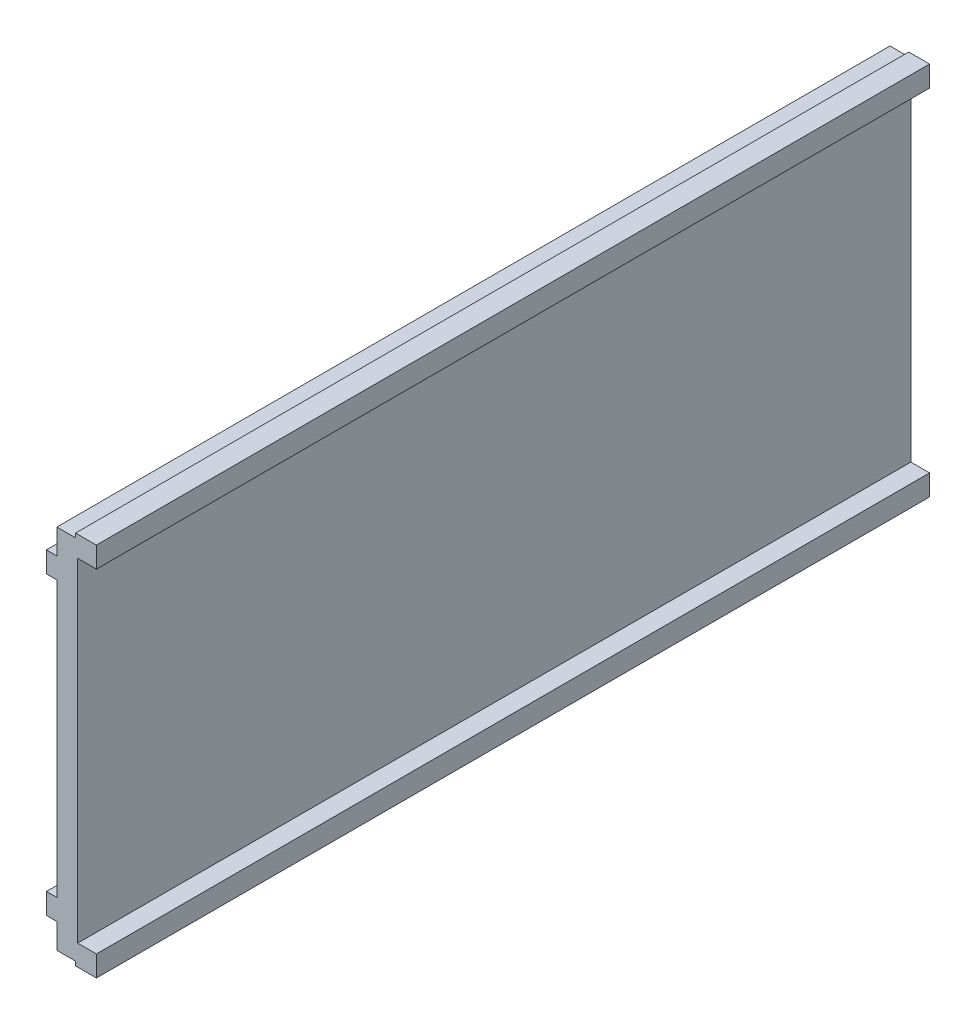
ISO-10303-21;
HEADER;
FILE_DESCRIPTION(('STEP AP214'),'2;1');
FILE_NAME('part.step','',(''),(''),'','','');
FILE_SCHEMA(('AUTOMOTIVE_DESIGN { 1 0 10303 214 1 1 1 1 }'));
ENDSEC;
DATA;
#1=APPLICATION_CONTEXT('core data for automotive mechanical design processes');
#2=APPLICATION_PROTOCOL_DEFINITION('international standard','automotive_design',2000,#1);
#3=PRODUCT_CONTEXT('',#1,'mechanical');
#4=PRODUCT('Part','Part','',(#3));
#5=PRODUCT_RELATED_PRODUCT_CATEGORY('part','',(#4));
#6=PRODUCT_DEFINITION_FORMATION('','',#4);
#7=PRODUCT_DEFINITION_CONTEXT('part definition',#1,'design');
#8=PRODUCT_DEFINITION('design','',#6,#7);
#9=PRODUCT_DEFINITION_SHAPE('','',#8);
#10=(LENGTH_UNIT() NAMED_UNIT(*) SI_UNIT(.MILLI.,.METRE.));
#11=(NAMED_UNIT(*) PLANE_ANGLE_UNIT() SI_UNIT($,.RADIAN.));
#12=(NAMED_UNIT(*) SI_UNIT($,.STERADIAN.) SOLID_ANGLE_UNIT());
#13=UNCERTAINTY_MEASURE_WITH_UNIT(LENGTH_MEASURE(1.E-05),#10,'distance_accuracy_value','');
#14=(GEOMETRIC_REPRESENTATION_CONTEXT(3) GLOBAL_UNCERTAINTY_ASSIGNED_CONTEXT((#13)) GLOBAL_UNIT_ASSIGNED_CONTEXT((#10,
#11,#12)) REPRESENTATION_CONTEXT('',''));
#15=CARTESIAN_POINT('',(0.,0.,0.));
#16=DIRECTION('',(0.,0.,1.));
#17=DIRECTION('',(1.,0.,0.));
#18=AXIS2_PLACEMENT_3D('',#15,#16,#17);
#19=CARTESIAN_POINT('',(-41.0418835039148,-5.20889143025013,200.));
#20=DIRECTION('',(0.,-1.,0.));
#21=DIRECTION('',(1.,0.,0.));
#22=AXIS2_PLACEMENT_3D('',#19,#20,#21);
#23=PLANE('',#22);
#24=DIRECTION('',(-1.,0.,0.));
#25=VECTOR('',#24,1.);
#26=CARTESIAN_POINT('',(-41.0418835039148,-5.20889143025013,0.));
#27=LINE('',#26,#25);
#28=CARTESIAN_POINT('',(-41.0418835039148,-5.20889143025013,0.));
#29=VERTEX_POINT('',#28);
#30=CARTESIAN_POINT('',(-46.0418835039148,-5.20889143025013,0.));
#31=VERTEX_POINT('',#30);
#32=EDGE_CURVE('E207',#29,#31,#27,.T.);
#33=ORIENTED_EDGE('',*,*,#32,.T.);
#34=DIRECTION('',(0.,0.,-1.));
#35=VECTOR('',#34,1.);
#36=CARTESIAN_POINT('',(-46.0418835039148,-5.20889143025013,200.));
#37=LINE('',#36,#35);
#38=CARTESIAN_POINT('',(-46.0418835039148,-5.20889143025013,200.));
#39=VERTEX_POINT('',#38);
#40=EDGE_CURVE('E11',#39,#31,#37,.T.);
#41=ORIENTED_EDGE('',*,*,#40,.F.);
#42=DIRECTION('',(-1.,0.,0.));
#43=VECTOR('',#42,1.);
#44=CARTESIAN_POINT('',(-41.0418835039148,-5.20889143025013,200.));
#45=LINE('',#44,#43);
#46=CARTESIAN_POINT('',(-41.0418835039148,-5.20889143025013,200.));
#47=VERTEX_POINT('',#46);
#48=EDGE_CURVE('E245',#47,#39,#45,.T.);
#49=ORIENTED_EDGE('',*,*,#48,.F.);
#50=DIRECTION('',(0.,0.,-1.));
#51=VECTOR('',#50,1.);
#52=CARTESIAN_POINT('',(-41.0418835039148,-5.20889143025013,200.));
#53=LINE('',#52,#51);
#54=EDGE_CURVE('E203',#47,#29,#53,.T.);
#55=ORIENTED_EDGE('',*,*,#54,.T.);
#56=EDGE_LOOP('',(#33,#41,#49,#55));
#57=FACE_BOUND('',#56,.T.);
#58=ADVANCED_FACE('F39',(#57),#23,.F.);
#59=CARTESIAN_POINT('',(-46.0418835039148,-5.20889143025013,200.));
#60=DIRECTION('',(1.,0.,0.));
#61=DIRECTION('',(0.,1.,0.));
#62=AXIS2_PLACEMENT_3D('',#59,#60,#61);
#63=PLANE('',#62);
#64=DIRECTION('',(0.,-1.,0.));
#65=VECTOR('',#64,1.);
#66=CARTESIAN_POINT('',(-46.0418835039148,-5.20889143025013,0.));
#67=LINE('',#66,#65);
#68=CARTESIAN_POINT('',(-46.0418835039148,-6.20889143025013,0.));
#69=VERTEX_POINT('',#68);
#70=EDGE_CURVE('E210',#31,#69,#67,.T.);
#71=ORIENTED_EDGE('',*,*,#70,.T.);
#72=DIRECTION('',(0.,0.,-1.));
#73=VECTOR('',#72,1.);
#74=CARTESIAN_POINT('',(-46.0418835039148,-6.20889143025013,200.));
#75=LINE('',#74,#73);
#76=CARTESIAN_POINT('',(-46.0418835039148,-6.20889143025013,200.));
#77=VERTEX_POINT('',#76);
#78=EDGE_CURVE('E47',#77,#69,#75,.T.);
#79=ORIENTED_EDGE('',*,*,#78,.F.);
#80=DIRECTION('',(0.,-1.,0.));
#81=VECTOR('',#80,1.);
#82=CARTESIAN_POINT('',(-46.0418835039148,-5.20889143025013,200.));
#83=LINE('',#82,#81);
#84=EDGE_CURVE('E134',#39,#77,#83,.T.);
#85=ORIENTED_EDGE('',*,*,#84,.F.);
#86=ORIENTED_EDGE('',*,*,#40,.T.);
#87=EDGE_LOOP('',(#71,#79,#85,#86));
#88=FACE_BOUND('',#87,.T.);
#89=ADVANCED_FACE('F363',(#88),#63,.F.);
#90=CARTESIAN_POINT('',(-46.0418835039148,-6.20889143025013,200.));
#91=DIRECTION('',(0.,-1.,0.));
#92=DIRECTION('',(1.,0.,0.));
#93=AXIS2_PLACEMENT_3D('',#90,#91,#92);
#94=PLANE('',#93);
#95=DIRECTION('',(-1.,0.,0.));
#96=VECTOR('',#95,1.);
#97=CARTESIAN_POINT('',(-46.0418835039148,-6.20889143025013,0.));
#98=LINE('',#97,#96);
#99=CARTESIAN_POINT('',(-50.5418835039148,-6.20889143025013,0.));
#100=VERTEX_POINT('',#99);
#101=EDGE_CURVE('E212',#69,#100,#98,.T.);
#102=ORIENTED_EDGE('',*,*,#101,.T.);
#103=DIRECTION('',(0.,0.,-1.));
#104=VECTOR('',#103,1.);
#105=CARTESIAN_POINT('',(-50.5418835039148,-6.20889143025013,200.));
#106=LINE('',#105,#104);
#107=CARTESIAN_POINT('',(-50.5418835039148,-6.20889143025013,200.));
#108=VERTEX_POINT('',#107);
#109=EDGE_CURVE('E288',#108,#100,#106,.T.);
#110=ORIENTED_EDGE('',*,*,#109,.F.);
#111=DIRECTION('',(-1.,0.,0.));
#112=VECTOR('',#111,1.);
#113=CARTESIAN_POINT('',(-46.0418835039148,-6.20889143025013,200.));
#114=LINE('',#113,#112);
#115=EDGE_CURVE('E296',#77,#108,#114,.T.);
#116=ORIENTED_EDGE('',*,*,#115,.F.);
#117=ORIENTED_EDGE('',*,*,#78,.T.);
#118=EDGE_LOOP('',(#102,#110,#116,#117));
#119=FACE_BOUND('',#118,.T.);
#120=ADVANCED_FACE('F294',(#119),#94,.F.);
#121=CARTESIAN_POINT('',(-50.5418835039148,-6.20889143025013,200.));
#122=DIRECTION('',(1.,0.,0.));
#123=DIRECTION('',(0.,0.,-1.));
#124=AXIS2_PLACEMENT_3D('',#121,#122,#123);
#125=PLANE('',#124);
#126=DIRECTION('',(0.,-1.,0.));
#127=VECTOR('',#126,1.);
#128=CARTESIAN_POINT('',(-50.5418835039148,-6.20889143025013,0.));
#129=LINE('',#128,#127);
#130=CARTESIAN_POINT('',(-50.5418835039148,-12.2088914302501,0.));
#131=VERTEX_POINT('',#130);
#132=EDGE_CURVE('E214',#100,#131,#129,.T.);
#133=ORIENTED_EDGE('',*,*,#132,.T.);
#134=DIRECTION('',(0.,0.,-1.));
#135=VECTOR('',#134,1.);
#136=CARTESIAN_POINT('',(-50.5418835039148,-12.2088914302501,200.));
#137=LINE('',#136,#135);
#138=CARTESIAN_POINT('',(-50.5418835039148,-12.2088914302501,200.));
#139=VERTEX_POINT('',#138);
#140=EDGE_CURVE('E285',#139,#131,#137,.T.);
#141=ORIENTED_EDGE('',*,*,#140,.F.);
#142=DIRECTION('',(0.,-1.,0.));
#143=VECTOR('',#142,1.);
#144=CARTESIAN_POINT('',(-50.5418835039148,-6.20889143025013,200.));
#145=LINE('',#144,#143);
#146=EDGE_CURVE('E314',#108,#139,#145,.T.);
#147=ORIENTED_EDGE('',*,*,#146,.F.);
#148=ORIENTED_EDGE('',*,*,#109,.T.);
#149=EDGE_LOOP('',(#133,#141,#147,#148));
#150=FACE_BOUND('',#149,.T.);
#151=ADVANCED_FACE('F305',(#150),#125,.F.);
#152=CARTESIAN_POINT('',(-53.0418835039148,-12.2088914302501,200.));
#153=DIRECTION('',(0.,-1.,0.));
#154=DIRECTION('',(0.,0.,-1.));
#155=AXIS2_PLACEMENT_3D('',#152,#153,#154);
#156=PLANE('',#155);
#157=DIRECTION('',(-1.,0.,0.));
#158=VECTOR('',#157,1.);
#159=CARTESIAN_POINT('',(-53.0418835039148,-12.2088914302501,0.));
#160=LINE('',#159,#158);
#161=CARTESIAN_POINT('',(-53.0418835039148,-12.2088914302501,0.));
#162=VERTEX_POINT('',#161);
#163=EDGE_CURVE('E216',#131,#162,#160,.T.);
#164=ORIENTED_EDGE('',*,*,#163,.T.);
#165=DIRECTION('',(0.,0.,-1.));
#166=VECTOR('',#165,1.);
#167=CARTESIAN_POINT('',(-53.0418835039148,-12.2088914302501,200.));
#168=LINE('',#167,#166);
#169=CARTESIAN_POINT('',(-53.0418835039148,-12.2088914302501,200.));
#170=VERTEX_POINT('',#169);
#171=EDGE_CURVE('E282',#170,#162,#168,.T.);
#172=ORIENTED_EDGE('',*,*,#171,.F.);
#173=DIRECTION('',(-1.,0.,0.));
#174=VECTOR('',#173,1.);
#175=CARTESIAN_POINT('',(-53.0418835039148,-12.2088914302501,200.));
#176=LINE('',#175,#174);
#177=EDGE_CURVE('E311',#139,#170,#176,.T.);
#178=ORIENTED_EDGE('',*,*,#177,.F.);
#179=ORIENTED_EDGE('',*,*,#140,.T.);
#180=EDGE_LOOP('',(#164,#172,#178,#179));
#181=FACE_BOUND('',#180,.T.);
#182=ADVANCED_FACE('F309',(#181),#156,.F.);
#183=CARTESIAN_POINT('',(-53.0418835039148,-12.2088914302501,200.));
#184=DIRECTION('',(1.,0.,0.));
#185=DIRECTION('',(0.,0.,-1.));
#186=AXIS2_PLACEMENT_3D('',#183,#184,#185);
#187=PLANE('',#186);
#188=DIRECTION('',(0.,-1.,0.));
#189=VECTOR('',#188,1.);
#190=CARTESIAN_POINT('',(-53.0418835039148,-12.2088914302501,0.));
#191=LINE('',#190,#189);
#192=CARTESIAN_POINT('',(-53.0418835039148,-17.2088914302501,0.));
#193=VERTEX_POINT('',#192);
#194=EDGE_CURVE('E218',#162,#193,#191,.T.);
#195=ORIENTED_EDGE('',*,*,#194,.T.);
#196=DIRECTION('',(0.,0.,-1.));
#197=VECTOR('',#196,1.);
#198=CARTESIAN_POINT('',(-53.0418835039148,-17.2088914302501,200.));
#199=LINE('',#198,#197);
#200=CARTESIAN_POINT('',(-53.0418835039148,-17.2088914302501,200.));
#201=VERTEX_POINT('',#200);
#202=EDGE_CURVE('E279',#201,#193,#199,.T.);
#203=ORIENTED_EDGE('',*,*,#202,.F.);
#204=DIRECTION('',(0.,-1.,0.));
#205=VECTOR('',#204,1.);
#206=CARTESIAN_POINT('',(-53.0418835039148,-12.2088914302501,200.));
#207=LINE('',#206,#205);
#208=EDGE_CURVE('E313',#170,#201,#207,.T.);
#209=ORIENTED_EDGE('',*,*,#208,.F.);
#210=ORIENTED_EDGE('',*,*,#171,.T.);
#211=EDGE_LOOP('',(#195,#203,#209,#210));
#212=FACE_BOUND('',#211,.T.);
#213=ADVANCED_FACE('F376',(#212),#187,.F.);
#214=CARTESIAN_POINT('',(-53.0418835039148,-17.2088914302501,200.));
#215=DIRECTION('',(0.,1.,0.));
#216=DIRECTION('',(0.,0.,1.));
#217=AXIS2_PLACEMENT_3D('',#214,#215,#216);
#218=PLANE('',#217);
#219=DIRECTION('',(1.,0.,0.));
#220=VECTOR('',#219,1.);
#221=CARTESIAN_POINT('',(-53.0418835039148,-17.2088914302501,0.));
#222=LINE('',#221,#220);
#223=CARTESIAN_POINT('',(-50.5418835039148,-17.2088914302501,0.));
#224=VERTEX_POINT('',#223);
#225=EDGE_CURVE('E220',#193,#224,#222,.T.);
#226=ORIENTED_EDGE('',*,*,#225,.T.);
#227=DIRECTION('',(0.,0.,-1.));
#228=VECTOR('',#227,1.);
#229=CARTESIAN_POINT('',(-50.5418835039148,-17.2088914302501,200.));
#230=LINE('',#229,#228);
#231=CARTESIAN_POINT('',(-50.5418835039148,-17.2088914302501,200.));
#232=VERTEX_POINT('',#231);
#233=EDGE_CURVE('E276',#232,#224,#230,.T.);
#234=ORIENTED_EDGE('',*,*,#233,.F.);
#235=DIRECTION('',(1.,0.,0.));
#236=VECTOR('',#235,1.);
#237=CARTESIAN_POINT('',(-53.0418835039148,-17.2088914302501,200.));
#238=LINE('',#237,#236);
#239=EDGE_CURVE('E316',#201,#232,#238,.T.);
#240=ORIENTED_EDGE('',*,*,#239,.F.);
#241=ORIENTED_EDGE('',*,*,#202,.T.);
#242=EDGE_LOOP('',(#226,#234,#240,#241));
#243=FACE_BOUND('',#242,.T.);
#244=ADVANCED_FACE('F379',(#243),#218,.F.);
#245=CARTESIAN_POINT('',(-50.5418835039148,-17.2088914302501,200.));
#246=DIRECTION('',(1.,0.,0.));
#247=DIRECTION('',(0.,0.,-1.));
#248=AXIS2_PLACEMENT_3D('',#245,#246,#247);
#249=PLANE('',#248);
#250=DIRECTION('',(0.,-1.,0.));
#251=VECTOR('',#250,1.);
#252=CARTESIAN_POINT('',(-50.5418835039148,-17.2088914302501,0.));
#253=LINE('',#252,#251);
#254=CARTESIAN_POINT('',(-50.5418835039148,-83.2088914302501,0.));
#255=VERTEX_POINT('',#254);
#256=EDGE_CURVE('E222',#224,#255,#253,.T.);
#257=ORIENTED_EDGE('',*,*,#256,.T.);
#258=DIRECTION('',(0.,0.,-1.));
#259=VECTOR('',#258,1.);
#260=CARTESIAN_POINT('',(-50.5418835039148,-83.2088914302501,200.));
#261=LINE('',#260,#259);
#262=CARTESIAN_POINT('',(-50.5418835039148,-83.2088914302501,200.));
#263=VERTEX_POINT('',#262);
#264=EDGE_CURVE('E273',#263,#255,#261,.T.);
#265=ORIENTED_EDGE('',*,*,#264,.F.);
#266=DIRECTION('',(0.,-1.,0.));
#267=VECTOR('',#266,1.);
#268=CARTESIAN_POINT('',(-50.5418835039148,-17.2088914302501,200.));
#269=LINE('',#268,#267);
#270=EDGE_CURVE('E322',#232,#263,#269,.T.);
#271=ORIENTED_EDGE('',*,*,#270,.F.);
#272=ORIENTED_EDGE('',*,*,#233,.T.);
#273=EDGE_LOOP('',(#257,#265,#271,#272));
#274=FACE_BOUND('',#273,.T.);
#275=ADVANCED_FACE('F383',(#274),#249,.F.);
#276=CARTESIAN_POINT('',(-53.0418835039148,-83.2088914302501,200.));
#277=DIRECTION('',(0.,-1.,0.));
#278=DIRECTION('',(0.,0.,-1.));
#279=AXIS2_PLACEMENT_3D('',#276,#277,#278);
#280=PLANE('',#279);
#281=DIRECTION('',(-1.,0.,0.));
#282=VECTOR('',#281,1.);
#283=CARTESIAN_POINT('',(-53.0418835039148,-83.2088914302501,0.));
#284=LINE('',#283,#282);
#285=CARTESIAN_POINT('',(-53.0418835039148,-83.2088914302501,0.));
#286=VERTEX_POINT('',#285);
#287=EDGE_CURVE('E224',#255,#286,#284,.T.);
#288=ORIENTED_EDGE('',*,*,#287,.T.);
#289=DIRECTION('',(0.,0.,-1.));
#290=VECTOR('',#289,1.);
#291=CARTESIAN_POINT('',(-53.0418835039148,-83.2088914302501,200.));
#292=LINE('',#291,#290);
#293=CARTESIAN_POINT('',(-53.0418835039148,-83.2088914302501,200.));
#294=VERTEX_POINT('',#293);
#295=EDGE_CURVE('E270',#294,#286,#292,.T.);
#296=ORIENTED_EDGE('',*,*,#295,.F.);
#297=DIRECTION('',(-1.,0.,0.));
#298=VECTOR('',#297,1.);
#299=CARTESIAN_POINT('',(-53.0418835039148,-83.2088914302501,200.));
#300=LINE('',#299,#298);
#301=EDGE_CURVE('E324',#263,#294,#300,.T.);
#302=ORIENTED_EDGE('',*,*,#301,.F.);
#303=ORIENTED_EDGE('',*,*,#264,.T.);
#304=EDGE_LOOP('',(#288,#296,#302,#303));
#305=FACE_BOUND('',#304,.T.);
#306=ADVANCED_FACE('F387',(#305),#280,.F.);
#307=CARTESIAN_POINT('',(-53.0418835039148,-88.2088914302501,200.));
#308=DIRECTION('',(1.,0.,0.));
#309=DIRECTION('',(0.,0.,-1.));
#310=AXIS2_PLACEMENT_3D('',#307,#308,#309);
#311=PLANE('',#310);
#312=DIRECTION('',(0.,-1.,0.));
#313=VECTOR('',#312,1.);
#314=CARTESIAN_POINT('',(-53.0418835039148,-88.2088914302501,0.));
#315=LINE('',#314,#313);
#316=CARTESIAN_POINT('',(-53.0418835039148,-88.2088914302501,0.));
#317=VERTEX_POINT('',#316);
#318=EDGE_CURVE('E226',#286,#317,#315,.T.);
#319=ORIENTED_EDGE('',*,*,#318,.T.);
#320=DIRECTION('',(0.,0.,-1.));
#321=VECTOR('',#320,1.);
#322=CARTESIAN_POINT('',(-53.0418835039148,-88.2088914302501,200.));
#323=LINE('',#322,#321);
#324=CARTESIAN_POINT('',(-53.0418835039148,-88.2088914302501,200.));
#325=VERTEX_POINT('',#324);
#326=EDGE_CURVE('E267',#325,#317,#323,.T.);
#327=ORIENTED_EDGE('',*,*,#326,.F.);
#328=DIRECTION('',(0.,-1.,0.));
#329=VECTOR('',#328,1.);
#330=CARTESIAN_POINT('',(-53.0418835039148,-88.2088914302501,200.));
#331=LINE('',#330,#329);
#332=EDGE_CURVE('E326',#294,#325,#331,.T.);
#333=ORIENTED_EDGE('',*,*,#332,.F.);
#334=ORIENTED_EDGE('',*,*,#295,.T.);
#335=EDGE_LOOP('',(#319,#327,#333,#334));
#336=FACE_BOUND('',#335,.T.);
#337=ADVANCED_FACE('F391',(#336),#311,.F.);
#338=CARTESIAN_POINT('',(-53.0418835039148,-88.2088914302501,200.));
#339=DIRECTION('',(0.,1.,0.));
#340=DIRECTION('',(0.,0.,1.));
#341=AXIS2_PLACEMENT_3D('',#338,#339,#340);
#342=PLANE('',#341);
#343=DIRECTION('',(1.,0.,0.));
#344=VECTOR('',#343,1.);
#345=CARTESIAN_POINT('',(-53.0418835039148,-88.2088914302501,0.));
#346=LINE('',#345,#344);
#347=CARTESIAN_POINT('',(-50.5418835039148,-88.2088914302501,0.));
#348=VERTEX_POINT('',#347);
#349=EDGE_CURVE('E228',#317,#348,#346,.T.);
#350=ORIENTED_EDGE('',*,*,#349,.T.);
#351=DIRECTION('',(0.,0.,-1.));
#352=VECTOR('',#351,1.);
#353=CARTESIAN_POINT('',(-50.5418835039148,-88.2088914302501,200.));
#354=LINE('',#353,#352);
#355=CARTESIAN_POINT('',(-50.5418835039148,-88.2088914302501,200.));
#356=VERTEX_POINT('',#355);
#357=EDGE_CURVE('E264',#356,#348,#354,.T.);
#358=ORIENTED_EDGE('',*,*,#357,.F.);
#359=DIRECTION('',(1.,0.,0.));
#360=VECTOR('',#359,1.);
#361=CARTESIAN_POINT('',(-53.0418835039148,-88.2088914302501,200.));
#362=LINE('',#361,#360);
#363=EDGE_CURVE('E328',#325,#356,#362,.T.);
#364=ORIENTED_EDGE('',*,*,#363,.F.);
#365=ORIENTED_EDGE('',*,*,#326,.T.);
#366=EDGE_LOOP('',(#350,#358,#364,#365));
#367=FACE_BOUND('',#366,.T.);
#368=ADVANCED_FACE('F395',(#367),#342,.F.);
#369=CARTESIAN_POINT('',(-50.5418835039148,-94.2088914302501,200.));
#370=DIRECTION('',(1.,0.,0.));
#371=DIRECTION('',(0.,0.,-1.));
#372=AXIS2_PLACEMENT_3D('',#369,#370,#371);
#373=PLANE('',#372);
#374=DIRECTION('',(0.,-1.,0.));
#375=VECTOR('',#374,1.);
#376=CARTESIAN_POINT('',(-50.5418835039148,-94.2088914302501,0.));
#377=LINE('',#376,#375);
#378=CARTESIAN_POINT('',(-50.5418835039148,-94.2088914302501,0.));
#379=VERTEX_POINT('',#378);
#380=EDGE_CURVE('E230',#348,#379,#377,.T.);
#381=ORIENTED_EDGE('',*,*,#380,.T.);
#382=DIRECTION('',(0.,0.,-1.));
#383=VECTOR('',#382,1.);
#384=CARTESIAN_POINT('',(-50.5418835039148,-94.2088914302501,200.));
#385=LINE('',#384,#383);
#386=CARTESIAN_POINT('',(-50.5418835039148,-94.2088914302501,200.));
#387=VERTEX_POINT('',#386);
#388=EDGE_CURVE('E261',#387,#379,#385,.T.);
#389=ORIENTED_EDGE('',*,*,#388,.F.);
#390=DIRECTION('',(0.,-1.,0.));
#391=VECTOR('',#390,1.);
#392=CARTESIAN_POINT('',(-50.5418835039148,-94.2088914302501,200.));
#393=LINE('',#392,#391);
#394=EDGE_CURVE('E330',#356,#387,#393,.T.);
#395=ORIENTED_EDGE('',*,*,#394,.F.);
#396=ORIENTED_EDGE('',*,*,#357,.T.);
#397=EDGE_LOOP('',(#381,#389,#395,#396));
#398=FACE_BOUND('',#397,.T.);
#399=ADVANCED_FACE('F399',(#398),#373,.F.);
#400=CARTESIAN_POINT('',(-46.0418835039148,-94.2088914302501,200.));
#401=DIRECTION('',(0.,1.,0.));
#402=DIRECTION('',(0.,0.,1.));
#403=AXIS2_PLACEMENT_3D('',#400,#401,#402);
#404=PLANE('',#403);
#405=DIRECTION('',(1.,0.,0.));
#406=VECTOR('',#405,1.);
#407=CARTESIAN_POINT('',(-46.0418835039148,-94.2088914302501,0.));
#408=LINE('',#407,#406);
#409=CARTESIAN_POINT('',(-46.0418835039148,-94.2088914302501,0.));
#410=VERTEX_POINT('',#409);
#411=EDGE_CURVE('E232',#379,#410,#408,.T.);
#412=ORIENTED_EDGE('',*,*,#411,.T.);
#413=DIRECTION('',(0.,0.,-1.));
#414=VECTOR('',#413,1.);
#415=CARTESIAN_POINT('',(-46.0418835039148,-94.2088914302501,200.));
#416=LINE('',#415,#414);
#417=CARTESIAN_POINT('',(-46.0418835039148,-94.2088914302501,200.));
#418=VERTEX_POINT('',#417);
#419=EDGE_CURVE('E258',#418,#410,#416,.T.);
#420=ORIENTED_EDGE('',*,*,#419,.F.);
#421=DIRECTION('',(1.,0.,0.));
#422=VECTOR('',#421,1.);
#423=CARTESIAN_POINT('',(-46.0418835039148,-94.2088914302501,200.));
#424=LINE('',#423,#422);
#425=EDGE_CURVE('E332',#387,#418,#424,.T.);
#426=ORIENTED_EDGE('',*,*,#425,.F.);
#427=ORIENTED_EDGE('',*,*,#388,.T.);
#428=EDGE_LOOP('',(#412,#420,#426,#427));
#429=FACE_BOUND('',#428,.T.);
#430=ADVANCED_FACE('F403',(#429),#404,.F.);
#431=CARTESIAN_POINT('',(-46.0418835039148,-95.2088914302501,200.));
#432=DIRECTION('',(1.,0.,0.));
#433=DIRECTION('',(0.,1.,0.));
#434=AXIS2_PLACEMENT_3D('',#431,#432,#433);
#435=PLANE('',#434);
#436=DIRECTION('',(0.,-1.,0.));
#437=VECTOR('',#436,1.);
#438=CARTESIAN_POINT('',(-46.0418835039148,-95.2088914302501,0.));
#439=LINE('',#438,#437);
#440=CARTESIAN_POINT('',(-46.0418835039148,-95.2088914302501,0.));
#441=VERTEX_POINT('',#440);
#442=EDGE_CURVE('E234',#410,#441,#439,.T.);
#443=ORIENTED_EDGE('',*,*,#442,.T.);
#444=DIRECTION('',(0.,0.,-1.));
#445=VECTOR('',#444,1.);
#446=CARTESIAN_POINT('',(-46.0418835039148,-95.2088914302501,200.));
#447=LINE('',#446,#445);
#448=CARTESIAN_POINT('',(-46.0418835039148,-95.2088914302501,200.));
#449=VERTEX_POINT('',#448);
#450=EDGE_CURVE('E255',#449,#441,#447,.T.);
#451=ORIENTED_EDGE('',*,*,#450,.F.);
#452=DIRECTION('',(0.,-1.,0.));
#453=VECTOR('',#452,1.);
#454=CARTESIAN_POINT('',(-46.0418835039148,-95.2088914302501,200.));
#455=LINE('',#454,#453);
#456=EDGE_CURVE('E334',#418,#449,#455,.T.);
#457=ORIENTED_EDGE('',*,*,#456,.F.);
#458=ORIENTED_EDGE('',*,*,#419,.T.);
#459=EDGE_LOOP('',(#443,#451,#457,#458));
#460=FACE_BOUND('',#459,.T.);
#461=ADVANCED_FACE('F407',(#460),#435,.F.);
#462=CARTESIAN_POINT('',(-41.0418835039148,-95.2088914302501,200.));
#463=DIRECTION('',(0.,1.,0.));
#464=DIRECTION('',(0.,0.,1.));
#465=AXIS2_PLACEMENT_3D('',#462,#463,#464);
#466=PLANE('',#465);
#467=DIRECTION('',(1.,0.,0.));
#468=VECTOR('',#467,1.);
#469=CARTESIAN_POINT('',(-41.0418835039148,-95.2088914302501,0.));
#470=LINE('',#469,#468);
#471=CARTESIAN_POINT('',(-41.0418835039148,-95.2088914302501,0.));
#472=VERTEX_POINT('',#471);
#473=EDGE_CURVE('E236',#441,#472,#470,.T.);
#474=ORIENTED_EDGE('',*,*,#473,.T.);
#475=DIRECTION('',(0.,0.,-1.));
#476=VECTOR('',#475,1.);
#477=CARTESIAN_POINT('',(-41.0418835039148,-95.2088914302501,200.));
#478=LINE('',#477,#476);
#479=CARTESIAN_POINT('',(-41.0418835039148,-95.2088914302501,200.));
#480=VERTEX_POINT('',#479);
#481=EDGE_CURVE('E252',#480,#472,#478,.T.);
#482=ORIENTED_EDGE('',*,*,#481,.F.);
#483=DIRECTION('',(1.,0.,0.));
#484=VECTOR('',#483,1.);
#485=CARTESIAN_POINT('',(-41.0418835039148,-95.2088914302501,200.));
#486=LINE('',#485,#484);
#487=EDGE_CURVE('E336',#449,#480,#486,.T.);
#488=ORIENTED_EDGE('',*,*,#487,.F.);
#489=ORIENTED_EDGE('',*,*,#450,.T.);
#490=EDGE_LOOP('',(#474,#482,#488,#489));
#491=FACE_BOUND('',#490,.T.);
#492=ADVANCED_FACE('F411',(#491),#466,.F.);
#493=CARTESIAN_POINT('',(-41.0418835039148,-90.2088914302501,200.));
#494=DIRECTION('',(-1.,0.,0.));
#495=DIRECTION('',(0.,0.,1.));
#496=AXIS2_PLACEMENT_3D('',#493,#494,#495);
#497=PLANE('',#496);
#498=DIRECTION('',(0.,1.,0.));
#499=VECTOR('',#498,1.);
#500=CARTESIAN_POINT('',(-41.0418835039148,-90.2088914302501,0.));
#501=LINE('',#500,#499);
#502=CARTESIAN_POINT('',(-41.0418835039148,-90.2088914302501,0.));
#503=VERTEX_POINT('',#502);
#504=EDGE_CURVE('E238',#472,#503,#501,.T.);
#505=ORIENTED_EDGE('',*,*,#504,.T.);
#506=DIRECTION('',(0.,0.,-1.));
#507=VECTOR('',#506,1.);
#508=CARTESIAN_POINT('',(-41.0418835039148,-90.2088914302501,200.));
#509=LINE('',#508,#507);
#510=CARTESIAN_POINT('',(-41.0418835039148,-90.2088914302501,200.));
#511=VERTEX_POINT('',#510);
#512=EDGE_CURVE('E249',#511,#503,#509,.T.);
#513=ORIENTED_EDGE('',*,*,#512,.F.);
#514=DIRECTION('',(0.,1.,0.));
#515=VECTOR('',#514,1.);
#516=CARTESIAN_POINT('',(-41.0418835039148,-90.2088914302501,200.));
#517=LINE('',#516,#515);
#518=EDGE_CURVE('E338',#480,#511,#517,.T.);
#519=ORIENTED_EDGE('',*,*,#518,.F.);
#520=ORIENTED_EDGE('',*,*,#481,.T.);
#521=EDGE_LOOP('',(#505,#513,#519,#520));
#522=FACE_BOUND('',#521,.T.);
#523=ADVANCED_FACE('F344',(#522),#497,.F.);
#524=CARTESIAN_POINT('',(-45.5418835039148,-90.2088914302501,200.));
#525=DIRECTION('',(0.,-1.,0.));
#526=DIRECTION('',(0.,0.,-1.));
#527=AXIS2_PLACEMENT_3D('',#524,#525,#526);
#528=PLANE('',#527);
#529=DIRECTION('',(-1.,0.,0.));
#530=VECTOR('',#529,1.);
#531=CARTESIAN_POINT('',(-45.5418835039148,-90.2088914302501,0.));
#532=LINE('',#531,#530);
#533=CARTESIAN_POINT('',(-45.5418835039148,-90.2088914302501,0.));
#534=VERTEX_POINT('',#533);
#535=EDGE_CURVE('E240',#503,#534,#532,.T.);
#536=ORIENTED_EDGE('',*,*,#535,.T.);
#537=DIRECTION('',(0.,0.,-1.));
#538=VECTOR('',#537,1.);
#539=CARTESIAN_POINT('',(-45.5418835039148,-90.2088914302501,200.));
#540=LINE('',#539,#538);
#541=CARTESIAN_POINT('',(-45.5418835039148,-90.2088914302501,200.));
#542=VERTEX_POINT('',#541);
#543=EDGE_CURVE('E198',#542,#534,#540,.T.);
#544=ORIENTED_EDGE('',*,*,#543,.F.);
#545=DIRECTION('',(-1.,0.,0.));
#546=VECTOR('',#545,1.);
#547=CARTESIAN_POINT('',(-45.5418835039148,-90.2088914302501,200.));
#548=LINE('',#547,#546);
#549=EDGE_CURVE('E189',#511,#542,#548,.T.);
#550=ORIENTED_EDGE('',*,*,#549,.F.);
#551=ORIENTED_EDGE('',*,*,#512,.T.);
#552=EDGE_LOOP('',(#536,#544,#550,#551));
#553=FACE_BOUND('',#552,.T.);
#554=ADVANCED_FACE('F348',(#553),#528,.F.);
#555=CARTESIAN_POINT('',(-45.5418835039148,-10.2088914302501,200.));
#556=DIRECTION('',(-1.,0.,0.));
#557=DIRECTION('',(0.,0.,1.));
#558=AXIS2_PLACEMENT_3D('',#555,#556,#557);
#559=PLANE('',#558);
#560=DIRECTION('',(0.,1.,0.));
#561=VECTOR('',#560,1.);
#562=CARTESIAN_POINT('',(-45.5418835039148,-10.2088914302501,0.));
#563=LINE('',#562,#561);
#564=CARTESIAN_POINT('',(-45.5418835039148,-10.2088914302501,0.));
#565=VERTEX_POINT('',#564);
#566=EDGE_CURVE('E197',#534,#565,#563,.T.);
#567=ORIENTED_EDGE('',*,*,#566,.T.);
#568=DIRECTION('',(0.,0.,-1.));
#569=VECTOR('',#568,1.);
#570=CARTESIAN_POINT('',(-45.5418835039148,-10.2088914302501,200.));
#571=LINE('',#570,#569);
#572=CARTESIAN_POINT('',(-45.5418835039148,-10.2088914302501,200.));
#573=VERTEX_POINT('',#572);
#574=EDGE_CURVE('E194',#573,#565,#571,.T.);
#575=ORIENTED_EDGE('',*,*,#574,.F.);
#576=DIRECTION('',(0.,1.,0.));
#577=VECTOR('',#576,1.);
#578=CARTESIAN_POINT('',(-45.5418835039148,-10.2088914302501,200.));
#579=LINE('',#578,#577);
#580=EDGE_CURVE('E183',#542,#573,#579,.T.);
#581=ORIENTED_EDGE('',*,*,#580,.F.);
#582=ORIENTED_EDGE('',*,*,#543,.T.);
#583=EDGE_LOOP('',(#567,#575,#581,#582));
#584=FACE_BOUND('',#583,.T.);
#585=ADVANCED_FACE('F195',(#584),#559,.F.);
#586=CARTESIAN_POINT('',(-45.5418835039148,-10.2088914302501,200.));
#587=DIRECTION('',(0.,1.,0.));
#588=DIRECTION('',(0.,0.,1.));
#589=AXIS2_PLACEMENT_3D('',#586,#587,#588);
#590=PLANE('',#589);
#591=DIRECTION('',(1.,0.,0.));
#592=VECTOR('',#591,1.);
#593=CARTESIAN_POINT('',(-45.5418835039148,-10.2088914302501,0.));
#594=LINE('',#593,#592);
#595=CARTESIAN_POINT('',(-41.0418835039148,-10.2088914302501,0.));
#596=VERTEX_POINT('',#595);
#597=EDGE_CURVE('E120',#565,#596,#594,.T.);
#598=ORIENTED_EDGE('',*,*,#597,.T.);
#599=DIRECTION('',(0.,0.,-1.));
#600=VECTOR('',#599,1.);
#601=CARTESIAN_POINT('',(-41.0418835039148,-10.2088914302501,200.));
#602=LINE('',#601,#600);
#603=CARTESIAN_POINT('',(-41.0418835039148,-10.2088914302501,200.));
#604=VERTEX_POINT('',#603);
#605=EDGE_CURVE('E199',#604,#596,#602,.T.);
#606=ORIENTED_EDGE('',*,*,#605,.F.);
#607=DIRECTION('',(1.,0.,0.));
#608=VECTOR('',#607,1.);
#609=CARTESIAN_POINT('',(-45.5418835039148,-10.2088914302501,200.));
#610=LINE('',#609,#608);
#611=EDGE_CURVE('E187',#573,#604,#610,.T.);
#612=ORIENTED_EDGE('',*,*,#611,.F.);
#613=ORIENTED_EDGE('',*,*,#574,.T.);
#614=EDGE_LOOP('',(#598,#606,#612,#613));
#615=FACE_BOUND('',#614,.T.);
#616=ADVANCED_FACE('F201',(#615),#590,.F.);
#617=CARTESIAN_POINT('',(-41.0418835039148,-10.2088914302501,200.));
#618=DIRECTION('',(-1.,0.,0.));
#619=DIRECTION('',(0.,0.,1.));
#620=AXIS2_PLACEMENT_3D('',#617,#618,#619);
#621=PLANE('',#620);
#622=DIRECTION('',(0.,1.,0.));
#623=VECTOR('',#622,1.);
#624=CARTESIAN_POINT('',(-41.0418835039148,-10.2088914302501,0.));
#625=LINE('',#624,#623);
#626=EDGE_CURVE('E126',#596,#29,#625,.T.);
#627=ORIENTED_EDGE('',*,*,#626,.T.);
#628=ORIENTED_EDGE('',*,*,#54,.F.);
#629=DIRECTION('',(0.,1.,0.));
#630=VECTOR('',#629,1.);
#631=CARTESIAN_POINT('',(-41.0418835039148,-10.2088914302501,200.));
#632=LINE('',#631,#630);
#633=EDGE_CURVE('E55',#604,#47,#632,.T.);
#634=ORIENTED_EDGE('',*,*,#633,.F.);
#635=ORIENTED_EDGE('',*,*,#605,.T.);
#636=EDGE_LOOP('',(#627,#628,#634,#635));
#637=FACE_BOUND('',#636,.T.);
#638=ADVANCED_FACE('F352',(#637),#621,.F.);
#639=CARTESIAN_POINT('',(0.,0.,200.));
#640=DIRECTION('',(0.,0.,1.));
#641=DIRECTION('',(1.,0.,0.));
#642=AXIS2_PLACEMENT_3D('',#639,#640,#641);
#643=PLANE('',#642);
#644=ORIENTED_EDGE('',*,*,#48,.T.);
#645=ORIENTED_EDGE('',*,*,#84,.T.);
#646=ORIENTED_EDGE('',*,*,#115,.T.);
#647=ORIENTED_EDGE('',*,*,#146,.T.);
#648=ORIENTED_EDGE('',*,*,#177,.T.);
#649=ORIENTED_EDGE('',*,*,#208,.T.);
#650=ORIENTED_EDGE('',*,*,#239,.T.);
#651=ORIENTED_EDGE('',*,*,#270,.T.);
#652=ORIENTED_EDGE('',*,*,#301,.T.);
#653=ORIENTED_EDGE('',*,*,#332,.T.);
#654=ORIENTED_EDGE('',*,*,#363,.T.);
#655=ORIENTED_EDGE('',*,*,#394,.T.);
#656=ORIENTED_EDGE('',*,*,#425,.T.);
#657=ORIENTED_EDGE('',*,*,#456,.T.);
#658=ORIENTED_EDGE('',*,*,#487,.T.);
#659=ORIENTED_EDGE('',*,*,#518,.T.);
#660=ORIENTED_EDGE('',*,*,#549,.T.);
#661=ORIENTED_EDGE('',*,*,#580,.T.);
#662=ORIENTED_EDGE('',*,*,#611,.T.);
#663=ORIENTED_EDGE('',*,*,#633,.T.);
#664=EDGE_LOOP('',(#644,#645,#646,#647,#648,#649,#650,#651,#652,#653,#654,#655,#656,#657,#658,
#659,#660,#661,#662,#663));
#665=FACE_BOUND('',#664,.T.);
#666=ADVANCED_FACE('F185',(#665),#643,.T.);
#667=CARTESIAN_POINT('',(0.,0.,0.));
#668=DIRECTION('',(0.,0.,1.));
#669=DIRECTION('',(1.,0.,0.));
#670=AXIS2_PLACEMENT_3D('',#667,#668,#669);
#671=PLANE('',#670);
#672=ORIENTED_EDGE('',*,*,#32,.F.);
#673=ORIENTED_EDGE('',*,*,#626,.F.);
#674=ORIENTED_EDGE('',*,*,#597,.F.);
#675=ORIENTED_EDGE('',*,*,#566,.F.);
#676=ORIENTED_EDGE('',*,*,#535,.F.);
#677=ORIENTED_EDGE('',*,*,#504,.F.);
#678=ORIENTED_EDGE('',*,*,#473,.F.);
#679=ORIENTED_EDGE('',*,*,#442,.F.);
#680=ORIENTED_EDGE('',*,*,#411,.F.);
#681=ORIENTED_EDGE('',*,*,#380,.F.);
#682=ORIENTED_EDGE('',*,*,#349,.F.);
#683=ORIENTED_EDGE('',*,*,#318,.F.);
#684=ORIENTED_EDGE('',*,*,#287,.F.);
#685=ORIENTED_EDGE('',*,*,#256,.F.);
#686=ORIENTED_EDGE('',*,*,#225,.F.);
#687=ORIENTED_EDGE('',*,*,#194,.F.);
#688=ORIENTED_EDGE('',*,*,#163,.F.);
#689=ORIENTED_EDGE('',*,*,#132,.F.);
#690=ORIENTED_EDGE('',*,*,#101,.F.);
#691=ORIENTED_EDGE('',*,*,#70,.F.);
#692=EDGE_LOOP('',(#672,#673,#674,#675,#676,#677,#678,#679,#680,#681,#682,#683,#684,#685,#686,
#687,#688,#689,#690,#691));
#693=FACE_BOUND('',#692,.T.);
#694=ADVANCED_FACE('F300',(#693),#671,.F.);
#695=CLOSED_SHELL('',(#58,#89,#120,#151,#182,#213,#244,#275,#306,#337,#368,#399,#430,#461,#492,
#523,#554,#585,#616,#638,#666,#694));
#696=MANIFOLD_SOLID_BREP('B2',#695);
#697=ADVANCED_BREP_SHAPE_REPRESENTATION('',(#18,#696),#14);
#698=SHAPE_DEFINITION_REPRESENTATION(#9,#697);
ENDSEC;
END-ISO-10303-21;
